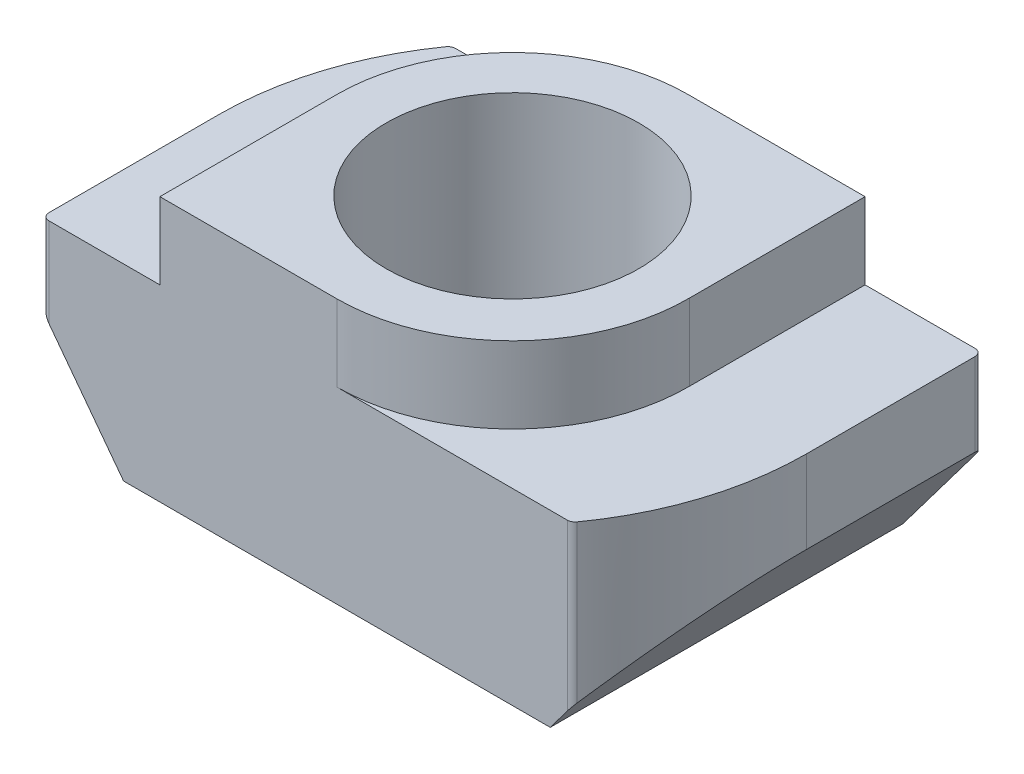
ISO-10303-21;
HEADER;
FILE_DESCRIPTION(('STEP AP214'),'2;1');
FILE_NAME('part.step','',(''),(''),'','','');
FILE_SCHEMA(('AUTOMOTIVE_DESIGN { 1 0 10303 214 1 1 1 1 }'));
ENDSEC;
DATA;
#1=APPLICATION_CONTEXT('core data for automotive mechanical design processes');
#2=APPLICATION_PROTOCOL_DEFINITION('international standard','automotive_design',2000,#1);
#3=PRODUCT_CONTEXT('',#1,'mechanical');
#4=PRODUCT('Part','Part','',(#3));
#5=PRODUCT_RELATED_PRODUCT_CATEGORY('part','',(#4));
#6=PRODUCT_DEFINITION_FORMATION('','',#4);
#7=PRODUCT_DEFINITION_CONTEXT('part definition',#1,'design');
#8=PRODUCT_DEFINITION('design','',#6,#7);
#9=PRODUCT_DEFINITION_SHAPE('','',#8);
#10=(LENGTH_UNIT() NAMED_UNIT(*) SI_UNIT(.MILLI.,.METRE.));
#11=(NAMED_UNIT(*) PLANE_ANGLE_UNIT() SI_UNIT($,.RADIAN.));
#12=(NAMED_UNIT(*) SI_UNIT($,.STERADIAN.) SOLID_ANGLE_UNIT());
#13=UNCERTAINTY_MEASURE_WITH_UNIT(LENGTH_MEASURE(1.E-05),#10,'distance_accuracy_value','');
#14=(GEOMETRIC_REPRESENTATION_CONTEXT(3) GLOBAL_UNCERTAINTY_ASSIGNED_CONTEXT((#13)) GLOBAL_UNIT_ASSIGNED_CONTEXT((#10,
#11,#12)) REPRESENTATION_CONTEXT('',''));
#15=CARTESIAN_POINT('',(0.,0.,0.));
#16=DIRECTION('',(0.,0.,1.));
#17=DIRECTION('',(1.,0.,0.));
#18=AXIS2_PLACEMENT_3D('',#15,#16,#17);
#19=CARTESIAN_POINT('',(-3.97863865589294,3.2,-2.85267364326445));
#20=DIRECTION('',(0.,-1.,0.));
#21=DIRECTION('',(0.,0.,-1.));
#22=AXIS2_PLACEMENT_3D('',#19,#20,#21);
#23=PLANE('',#22);
#24=DIRECTION('',(0.,0.,1.));
#25=VECTOR('',#24,1.);
#26=CARTESIAN_POINT('',(-3.01232635673555,3.2,3.01232635673555));
#27=LINE('',#26,#25);
#28=CARTESIAN_POINT('',(-3.01232635673555,3.2,0.));
#29=VERTEX_POINT('',#28);
#30=CARTESIAN_POINT('',(-3.01232635673555,3.2,3.01232635673555));
#31=VERTEX_POINT('',#30);
#32=EDGE_CURVE('E357',#29,#31,#27,.T.);
#33=ORIENTED_EDGE('',*,*,#32,.F.);
#34=CARTESIAN_POINT('',(-0.024551835244514,3.2,0.));
#35=DIRECTION('',(0.,1.,0.));
#36=DIRECTION('',(0.,0.,-1.));
#37=AXIS2_PLACEMENT_3D('',#34,#35,#36);
#38=CIRCLE('',#37,2.98777452149103);
#39=CARTESIAN_POINT('',(-0.0491036704889641,3.2,-2.98767364326445));
#40=VERTEX_POINT('',#39);
#41=EDGE_CURVE('E241',#40,#29,#38,.T.);
#42=ORIENTED_EDGE('',*,*,#41,.F.);
#43=DIRECTION('',(-1.,0.,0.));
#44=VECTOR('',#43,1.);
#45=CARTESIAN_POINT('',(4.85945607210742,3.2,-2.98767364326445));
#46=LINE('',#45,#44);
#47=CARTESIAN_POINT('',(-3.97863865589294,3.2,-2.98767364326445));
#48=VERTEX_POINT('',#47);
#49=EDGE_CURVE('E265',#40,#48,#46,.T.);
#50=ORIENTED_EDGE('',*,*,#49,.T.);
#51=CARTESIAN_POINT('',(-3.97863865589294,3.2,-2.85267364326445));
#52=DIRECTION('',(0.,1.,0.));
#53=DIRECTION('',(0.,0.,-1.));
#54=AXIS2_PLACEMENT_3D('',#51,#52,#53);
#55=CIRCLE('',#54,0.135);
#56=CARTESIAN_POINT('',(-4.08885480736663,3.2,-2.93063132379901));
#57=VERTEX_POINT('',#56);
#58=EDGE_CURVE('E188',#48,#57,#55,.T.);
#59=ORIENTED_EDGE('',*,*,#58,.T.);
#60=CARTESIAN_POINT('',(0.0544560721074221,3.2,0.));
#61=DIRECTION('',(0.,1.,0.));
#62=DIRECTION('',(0.,0.,-1.));
#63=AXIS2_PLACEMENT_3D('',#60,#61,#62);
#64=CIRCLE('',#63,5.075);
#65=CARTESIAN_POINT('',(-5.02054392789258,3.2,0.));
#66=VERTEX_POINT('',#65);
#67=EDGE_CURVE('E195',#57,#66,#64,.T.);
#68=ORIENTED_EDGE('',*,*,#67,.T.);
#69=DIRECTION('',(0.,0.,1.));
#70=VECTOR('',#69,1.);
#71=CARTESIAN_POINT('',(-5.02054392789258,3.2,2.89232635673555));
#72=LINE('',#71,#70);
#73=CARTESIAN_POINT('',(-5.02054392789258,3.2,2.89232635673555));
#74=VERTEX_POINT('',#73);
#75=EDGE_CURVE('E299',#66,#74,#72,.T.);
#76=ORIENTED_EDGE('',*,*,#75,.T.);
#77=CARTESIAN_POINT('',(-4.90054392789258,3.2,2.89232635673555));
#78=DIRECTION('',(0.,1.,0.));
#79=DIRECTION('',(0.,0.,-1.));
#80=AXIS2_PLACEMENT_3D('',#77,#78,#79);
#81=CIRCLE('',#80,0.12);
#82=CARTESIAN_POINT('',(-4.90054392789258,3.2,3.01232635673555));
#83=VERTEX_POINT('',#82);
#84=EDGE_CURVE('E252',#74,#83,#81,.T.);
#85=ORIENTED_EDGE('',*,*,#84,.T.);
#86=DIRECTION('',(1.,0.,0.));
#87=VECTOR('',#86,1.);
#88=CARTESIAN_POINT('',(3.92,3.2,3.01232635673555));
#89=LINE('',#88,#87);
#90=EDGE_CURVE('E242',#83,#31,#89,.T.);
#91=ORIENTED_EDGE('',*,*,#90,.T.);
#92=EDGE_LOOP('',(#33,#42,#50,#59,#68,#76,#85,#91));
#93=FACE_BOUND('',#92,.T.);
#94=ADVANCED_FACE('F43',(#93),#23,.F.);
#95=CARTESIAN_POINT('',(0.,3.2,0.0245518352445135));
#96=DIRECTION('',(0.,1.,0.));
#97=DIRECTION('',(0.,0.,1.));
#98=AXIS2_PLACEMENT_3D('',#95,#96,#97);
#99=CIRCLE('',#98,2.98777452149103);
#100=CARTESIAN_POINT('',(0.,3.2,3.01232635673555));
#101=VERTEX_POINT('',#100);
#102=CARTESIAN_POINT('',(2.98767364326445,3.2,0.));
#103=VERTEX_POINT('',#102);
#104=EDGE_CURVE('E358',#101,#103,#99,.T.);
#105=ORIENTED_EDGE('',*,*,#104,.F.);
#106=CARTESIAN_POINT('',(3.92,3.2,3.01232635673555));
#107=VERTEX_POINT('',#106);
#108=EDGE_CURVE('E247',#101,#107,#89,.T.);
#109=ORIENTED_EDGE('',*,*,#108,.T.);
#110=CARTESIAN_POINT('',(3.92,3.2,2.87732635673555));
#111=DIRECTION('',(0.,1.,0.));
#112=DIRECTION('',(0.,0.,-1.));
#113=AXIS2_PLACEMENT_3D('',#110,#111,#112);
#114=CIRCLE('',#113,0.134999999999999);
#115=CARTESIAN_POINT('',(4.02973652434524,3.2,2.9559577450269));
#116=VERTEX_POINT('',#115);
#117=EDGE_CURVE('E246',#107,#116,#114,.T.);
#118=ORIENTED_EDGE('',*,*,#117,.T.);
#119=CARTESIAN_POINT('',(-0.0955439278925783,3.2,0.));
#120=DIRECTION('',(0.,1.,0.));
#121=DIRECTION('',(0.,0.,1.));
#122=AXIS2_PLACEMENT_3D('',#119,#120,#121);
#123=CIRCLE('',#122,5.075);
#124=CARTESIAN_POINT('',(4.97945607210742,3.2,0.));
#125=VERTEX_POINT('',#124);
#126=EDGE_CURVE('E257',#116,#125,#123,.T.);
#127=ORIENTED_EDGE('',*,*,#126,.T.);
#128=DIRECTION('',(0.,0.,-1.));
#129=VECTOR('',#128,1.);
#130=CARTESIAN_POINT('',(4.97945607210742,3.2,0.));
#131=LINE('',#130,#129);
#132=CARTESIAN_POINT('',(4.97945607210742,3.2,-2.86767364326445));
#133=VERTEX_POINT('',#132);
#134=EDGE_CURVE('E260',#125,#133,#131,.T.);
#135=ORIENTED_EDGE('',*,*,#134,.T.);
#136=CARTESIAN_POINT('',(4.85945607210742,3.2,-2.86767364326445));
#137=DIRECTION('',(0.,1.,0.));
#138=DIRECTION('',(0.,0.,1.));
#139=AXIS2_PLACEMENT_3D('',#136,#137,#138);
#140=CIRCLE('',#139,0.12);
#141=CARTESIAN_POINT('',(4.85945607210742,3.2,-2.98767364326445));
#142=VERTEX_POINT('',#141);
#143=EDGE_CURVE('E263',#133,#142,#140,.T.);
#144=ORIENTED_EDGE('',*,*,#143,.T.);
#145=CARTESIAN_POINT('',(2.98767364326445,3.2,-2.98767364326445));
#146=VERTEX_POINT('',#145);
#147=EDGE_CURVE('E206',#142,#146,#46,.T.);
#148=ORIENTED_EDGE('',*,*,#147,.T.);
#149=DIRECTION('',(0.,0.,-1.));
#150=VECTOR('',#149,1.);
#151=CARTESIAN_POINT('',(2.98767364326445,3.2,0.));
#152=LINE('',#151,#150);
#153=EDGE_CURVE('E352',#103,#146,#152,.T.);
#154=ORIENTED_EDGE('',*,*,#153,.F.);
#155=EDGE_LOOP('',(#105,#109,#118,#127,#135,#144,#148,#154));
#156=FACE_BOUND('',#155,.T.);
#157=ADVANCED_FACE('F331',(#156),#23,.F.);
#158=CARTESIAN_POINT('',(-3.97863865589294,3.2,-2.85267364326445));
#159=DIRECTION('',(0.,-1.,0.));
#160=DIRECTION('',(0.,0.,-1.));
#161=AXIS2_PLACEMENT_3D('',#158,#159,#160);
#162=CYLINDRICAL_SURFACE('',#161,0.135);
#163=DIRECTION('',(0.,-1.,0.));
#164=VECTOR('',#163,1.);
#165=CARTESIAN_POINT('',(-3.97863865589294,3.2,-2.98767364326445));
#166=LINE('',#165,#164);
#167=CARTESIAN_POINT('',(-3.97863865589294,0.462659122919423,-2.98767364326445));
#168=VERTEX_POINT('',#167);
#169=EDGE_CURVE('E202',#48,#168,#166,.T.);
#170=ORIENTED_EDGE('',*,*,#169,.T.);
#171=CARTESIAN_POINT('',(-3.97863865589294,0.462659122919421,-2.85267364326445));
#172=DIRECTION('',(0.79863551004729,0.601815023152053,0.));
#173=DIRECTION('',(0.601815023152053,-0.79863551004729,0.));
#174=AXIS2_PLACEMENT_3D('',#171,#172,#173);
#175=ELLIPSE('',#174,0.224321419051533,0.135);
#176=CARTESIAN_POINT('',(-4.08885480736663,0.608920895991516,-2.93063132379901));
#177=VERTEX_POINT('',#176);
#178=EDGE_CURVE('E291',#168,#177,#175,.T.);
#179=ORIENTED_EDGE('',*,*,#178,.T.);
#180=DIRECTION('',(0.,-1.,0.));
#181=VECTOR('',#180,1.);
#182=CARTESIAN_POINT('',(-4.08885480736663,3.2,-2.93063132379901));
#183=LINE('',#182,#181);
#184=EDGE_CURVE('E237',#57,#177,#183,.T.);
#185=ORIENTED_EDGE('',*,*,#184,.F.);
#186=ORIENTED_EDGE('',*,*,#58,.F.);
#187=EDGE_LOOP('',(#170,#179,#185,#186));
#188=FACE_BOUND('',#187,.T.);
#189=ADVANCED_FACE('F45',(#188),#162,.T.);
#190=CARTESIAN_POINT('',(0.0544560721074221,3.2,0.));
#191=DIRECTION('',(0.,-1.,0.));
#192=DIRECTION('',(0.,0.,-1.));
#193=AXIS2_PLACEMENT_3D('',#190,#191,#192);
#194=CYLINDRICAL_SURFACE('',#193,5.075);
#195=ORIENTED_EDGE('',*,*,#184,.T.);
#196=CARTESIAN_POINT('',(0.0544560721074221,-4.88943835097798,0.));
#197=DIRECTION('',(0.79863551004729,0.601815023152053,0.));
#198=DIRECTION('',(0.601815023152053,-0.79863551004729,0.));
#199=AXIS2_PLACEMENT_3D('',#196,#197,#198);
#200=ELLIPSE('',#199,8.43282371619654,5.075);
#201=CARTESIAN_POINT('',(-5.02054392789258,1.84531411874553,0.));
#202=VERTEX_POINT('',#201);
#203=EDGE_CURVE('E296',#177,#202,#200,.T.);
#204=ORIENTED_EDGE('',*,*,#203,.T.);
#205=DIRECTION('',(0.,-1.,0.));
#206=VECTOR('',#205,1.);
#207=CARTESIAN_POINT('',(-5.02054392789258,3.2,0.));
#208=LINE('',#207,#206);
#209=EDGE_CURVE('E233',#66,#202,#208,.T.);
#210=ORIENTED_EDGE('',*,*,#209,.F.);
#211=ORIENTED_EDGE('',*,*,#67,.F.);
#212=EDGE_LOOP('',(#195,#204,#210,#211));
#213=FACE_BOUND('',#212,.T.);
#214=ADVANCED_FACE('F294',(#213),#194,.T.);
#215=CARTESIAN_POINT('',(-5.02054392789258,3.2,2.89232635673555));
#216=DIRECTION('',(1.,0.,0.));
#217=DIRECTION('',(0.,0.,-1.));
#218=AXIS2_PLACEMENT_3D('',#215,#216,#217);
#219=PLANE('',#218);
#220=ORIENTED_EDGE('',*,*,#209,.T.);
#221=DIRECTION('',(0.,0.,1.));
#222=VECTOR('',#221,1.);
#223=CARTESIAN_POINT('',(-5.02054392789258,1.84531411874553,-4.65));
#224=LINE('',#223,#222);
#225=CARTESIAN_POINT('',(-5.02054392789258,1.84531411874553,2.89232635673555));
#226=VERTEX_POINT('',#225);
#227=EDGE_CURVE('E497',#202,#226,#224,.T.);
#228=ORIENTED_EDGE('',*,*,#227,.T.);
#229=DIRECTION('',(0.,-1.,0.));
#230=VECTOR('',#229,1.);
#231=CARTESIAN_POINT('',(-5.02054392789258,3.2,2.89232635673555));
#232=LINE('',#231,#230);
#233=EDGE_CURVE('E229',#74,#226,#232,.T.);
#234=ORIENTED_EDGE('',*,*,#233,.F.);
#235=ORIENTED_EDGE('',*,*,#75,.F.);
#236=EDGE_LOOP('',(#220,#228,#234,#235));
#237=FACE_BOUND('',#236,.T.);
#238=ADVANCED_FACE('F501',(#237),#219,.F.);
#239=CARTESIAN_POINT('',(-4.90054392789258,3.2,2.89232635673555));
#240=DIRECTION('',(0.,-1.,0.));
#241=DIRECTION('',(0.,0.,-1.));
#242=AXIS2_PLACEMENT_3D('',#239,#240,#241);
#243=CYLINDRICAL_SURFACE('',#242,0.12);
#244=ORIENTED_EDGE('',*,*,#233,.T.);
#245=CARTESIAN_POINT('',(-4.90054392789258,1.68606874015108,2.89232635673555));
#246=DIRECTION('',(0.79863551004729,0.601815023152053,0.));
#247=DIRECTION('',(0.601815023152053,-0.79863551004729,0.));
#248=AXIS2_PLACEMENT_3D('',#245,#246,#247);
#249=ELLIPSE('',#248,0.199396816934697,0.12);
#250=CARTESIAN_POINT('',(-4.90054392789258,1.68606874015108,3.01232635673555));
#251=VERTEX_POINT('',#250);
#252=EDGE_CURVE('E395',#226,#251,#249,.T.);
#253=ORIENTED_EDGE('',*,*,#252,.T.);
#254=DIRECTION('',(0.,-1.,0.));
#255=VECTOR('',#254,1.);
#256=CARTESIAN_POINT('',(-4.90054392789258,3.2,3.01232635673555));
#257=LINE('',#256,#255);
#258=EDGE_CURVE('E225',#83,#251,#257,.T.);
#259=ORIENTED_EDGE('',*,*,#258,.F.);
#260=ORIENTED_EDGE('',*,*,#84,.F.);
#261=EDGE_LOOP('',(#244,#253,#259,#260));
#262=FACE_BOUND('',#261,.T.);
#263=ADVANCED_FACE('F444',(#262),#243,.T.);
#264=CARTESIAN_POINT('',(3.92,3.2,3.01232635673555));
#265=DIRECTION('',(0.,0.,-1.));
#266=DIRECTION('',(-1.,0.,0.));
#267=AXIS2_PLACEMENT_3D('',#264,#265,#266);
#268=PLANE('',#267);
#269=DIRECTION('',(1.,0.,0.));
#270=VECTOR('',#269,1.);
#271=CARTESIAN_POINT('',(3.92,0.,3.01232635673555));
#272=LINE('',#271,#270);
#273=CARTESIAN_POINT('',(-3.63,0.,3.01232635673555));
#274=VERTEX_POINT('',#273);
#275=CARTESIAN_POINT('',(3.63,0.,3.01232635673555));
#276=VERTEX_POINT('',#275);
#277=EDGE_CURVE('E189',#274,#276,#272,.T.);
#278=ORIENTED_EDGE('',*,*,#277,.T.);
#279=DIRECTION('',(0.601815023152053,0.79863551004729,0.));
#280=VECTOR('',#279,1.);
#281=CARTESIAN_POINT('',(5.27305129690785,2.18040271521824,3.01232635673555));
#282=LINE('',#281,#280);
#283=CARTESIAN_POINT('',(3.92,0.384842998269914,3.01232635673555));
#284=VERTEX_POINT('',#283);
#285=EDGE_CURVE('E58',#276,#284,#282,.T.);
#286=ORIENTED_EDGE('',*,*,#285,.T.);
#287=DIRECTION('',(0.,-1.,0.));
#288=VECTOR('',#287,1.);
#289=CARTESIAN_POINT('',(3.92,3.2,3.01232635673555));
#290=LINE('',#289,#288);
#291=EDGE_CURVE('E221',#107,#284,#290,.T.);
#292=ORIENTED_EDGE('',*,*,#291,.F.);
#293=ORIENTED_EDGE('',*,*,#108,.F.);
#294=DIRECTION('',(0.,-1.,0.));
#295=VECTOR('',#294,1.);
#296=CARTESIAN_POINT('',(0.,4.5,3.01232635673555));
#297=LINE('',#296,#295);
#298=CARTESIAN_POINT('',(0.,4.5,3.01232635673555));
#299=VERTEX_POINT('',#298);
#300=EDGE_CURVE('E382',#299,#101,#297,.T.);
#301=ORIENTED_EDGE('',*,*,#300,.F.);
#302=DIRECTION('',(1.,0.,0.));
#303=VECTOR('',#302,1.);
#304=CARTESIAN_POINT('',(0.,4.5,3.01232635673555));
#305=LINE('',#304,#303);
#306=CARTESIAN_POINT('',(-3.01232635673555,4.5,3.01232635673555));
#307=VERTEX_POINT('',#306);
#308=EDGE_CURVE('E364',#307,#299,#305,.T.);
#309=ORIENTED_EDGE('',*,*,#308,.F.);
#310=DIRECTION('',(0.,-1.,0.));
#311=VECTOR('',#310,1.);
#312=CARTESIAN_POINT('',(-3.01232635673555,4.5,3.01232635673555));
#313=LINE('',#312,#311);
#314=EDGE_CURVE('E378',#307,#31,#313,.T.);
#315=ORIENTED_EDGE('',*,*,#314,.T.);
#316=ORIENTED_EDGE('',*,*,#90,.F.);
#317=ORIENTED_EDGE('',*,*,#258,.T.);
#318=DIRECTION('',(0.601815023152053,-0.79863551004729,0.));
#319=VECTOR('',#318,1.);
#320=CARTESIAN_POINT('',(-2.43354973171045,-1.58774313285998,3.01232635673555));
#321=LINE('',#320,#319);
#322=EDGE_CURVE('E388',#251,#274,#321,.T.);
#323=ORIENTED_EDGE('',*,*,#322,.T.);
#324=EDGE_LOOP('',(#278,#286,#292,#293,#301,#309,#315,#316,#317,#323));
#325=FACE_BOUND('',#324,.T.);
#326=ADVANCED_FACE('F391',(#325),#268,.F.);
#327=CARTESIAN_POINT('',(3.92,3.2,2.87732635673555));
#328=DIRECTION('',(0.,-1.,0.));
#329=DIRECTION('',(0.,0.,-1.));
#330=AXIS2_PLACEMENT_3D('',#327,#328,#329);
#331=CYLINDRICAL_SURFACE('',#330,0.134999999999999);
#332=ORIENTED_EDGE('',*,*,#291,.T.);
#333=CARTESIAN_POINT('',(3.92,0.384842998269914,2.87732635673555));
#334=DIRECTION('',(-0.79863551004729,0.601815023152053,0.));
#335=DIRECTION('',(-0.601815023152053,-0.79863551004729,0.));
#336=AXIS2_PLACEMENT_3D('',#333,#334,#335);
#337=ELLIPSE('',#336,0.224321419051532,0.134999999999999);
#338=CARTESIAN_POINT('',(4.02973652434524,0.530468284644888,2.9559577450269));
#339=VERTEX_POINT('',#338);
#340=EDGE_CURVE('E493',#284,#339,#337,.T.);
#341=ORIENTED_EDGE('',*,*,#340,.T.);
#342=DIRECTION('',(0.,-1.,0.));
#343=VECTOR('',#342,1.);
#344=CARTESIAN_POINT('',(4.02973652434524,3.2,2.9559577450269));
#345=LINE('',#344,#343);
#346=EDGE_CURVE('E217',#116,#339,#345,.T.);
#347=ORIENTED_EDGE('',*,*,#346,.F.);
#348=ORIENTED_EDGE('',*,*,#117,.F.);
#349=EDGE_LOOP('',(#332,#341,#347,#348));
#350=FACE_BOUND('',#349,.T.);
#351=ADVANCED_FACE('F512',(#350),#331,.T.);
#352=CARTESIAN_POINT('',(-0.0955439278925783,3.2,0.));
#353=DIRECTION('',(0.,-1.,0.));
#354=DIRECTION('',(0.,0.,-1.));
#355=AXIS2_PLACEMENT_3D('',#352,#353,#354);
#356=CYLINDRICAL_SURFACE('',#355,5.075);
#357=ORIENTED_EDGE('',*,*,#346,.T.);
#358=CARTESIAN_POINT('',(-0.0955439278925783,-4.94396377722915,0.));
#359=DIRECTION('',(-0.79863551004729,0.601815023152053,0.));
#360=DIRECTION('',(-0.601815023152053,-0.79863551004729,0.));
#361=AXIS2_PLACEMENT_3D('',#358,#359,#360);
#362=ELLIPSE('',#361,8.43282371619654,5.075);
#363=CARTESIAN_POINT('',(4.97945607210742,1.79078869249435,0.));
#364=VERTEX_POINT('',#363);
#365=EDGE_CURVE('E489',#339,#364,#362,.T.);
#366=ORIENTED_EDGE('',*,*,#365,.T.);
#367=DIRECTION('',(0.,-1.,0.));
#368=VECTOR('',#367,1.);
#369=CARTESIAN_POINT('',(4.97945607210742,3.2,0.));
#370=LINE('',#369,#368);
#371=EDGE_CURVE('E213',#125,#364,#370,.T.);
#372=ORIENTED_EDGE('',*,*,#371,.F.);
#373=ORIENTED_EDGE('',*,*,#126,.F.);
#374=EDGE_LOOP('',(#357,#366,#372,#373));
#375=FACE_BOUND('',#374,.T.);
#376=ADVANCED_FACE('F515',(#375),#356,.T.);
#377=CARTESIAN_POINT('',(4.97945607210742,3.2,0.));
#378=DIRECTION('',(-1.,0.,0.));
#379=DIRECTION('',(0.,0.,1.));
#380=AXIS2_PLACEMENT_3D('',#377,#378,#379);
#381=PLANE('',#380);
#382=ORIENTED_EDGE('',*,*,#371,.T.);
#383=DIRECTION('',(0.,0.,-1.));
#384=VECTOR('',#383,1.);
#385=CARTESIAN_POINT('',(4.97945607210742,1.79078869249435,0.));
#386=LINE('',#385,#384);
#387=CARTESIAN_POINT('',(4.97945607210742,1.79078869249435,-2.86767364326445));
#388=VERTEX_POINT('',#387);
#389=EDGE_CURVE('E485',#364,#388,#386,.T.);
#390=ORIENTED_EDGE('',*,*,#389,.T.);
#391=DIRECTION('',(0.,-1.,0.));
#392=VECTOR('',#391,1.);
#393=CARTESIAN_POINT('',(4.97945607210742,3.2,-2.86767364326445));
#394=LINE('',#393,#392);
#395=EDGE_CURVE('E209',#133,#388,#394,.T.);
#396=ORIENTED_EDGE('',*,*,#395,.F.);
#397=ORIENTED_EDGE('',*,*,#134,.F.);
#398=EDGE_LOOP('',(#382,#390,#396,#397));
#399=FACE_BOUND('',#398,.T.);
#400=ADVANCED_FACE('F518',(#399),#381,.F.);
#401=CARTESIAN_POINT('',(4.85945607210742,3.2,-2.86767364326445));
#402=DIRECTION('',(0.,-1.,0.));
#403=DIRECTION('',(0.,0.,-1.));
#404=AXIS2_PLACEMENT_3D('',#401,#402,#403);
#405=CYLINDRICAL_SURFACE('',#404,0.12);
#406=ORIENTED_EDGE('',*,*,#395,.T.);
#407=CARTESIAN_POINT('',(4.85945607210742,1.6315433138999,-2.86767364326445));
#408=DIRECTION('',(-0.79863551004729,0.601815023152053,0.));
#409=DIRECTION('',(-0.601815023152053,-0.79863551004729,0.));
#410=AXIS2_PLACEMENT_3D('',#407,#408,#409);
#411=ELLIPSE('',#410,0.199396816934697,0.12);
#412=CARTESIAN_POINT('',(4.85945607210742,1.6315433138999,-2.98767364326445));
#413=VERTEX_POINT('',#412);
#414=EDGE_CURVE('E182',#388,#413,#411,.T.);
#415=ORIENTED_EDGE('',*,*,#414,.T.);
#416=DIRECTION('',(0.,-1.,0.));
#417=VECTOR('',#416,1.);
#418=CARTESIAN_POINT('',(4.85945607210742,3.2,-2.98767364326445));
#419=LINE('',#418,#417);
#420=EDGE_CURVE('E180',#142,#413,#419,.T.);
#421=ORIENTED_EDGE('',*,*,#420,.F.);
#422=ORIENTED_EDGE('',*,*,#143,.F.);
#423=EDGE_LOOP('',(#406,#415,#421,#422));
#424=FACE_BOUND('',#423,.T.);
#425=ADVANCED_FACE('F338',(#424),#405,.T.);
#426=CARTESIAN_POINT('',(4.85945607210742,3.2,-2.98767364326445));
#427=DIRECTION('',(0.,0.,1.));
#428=DIRECTION('',(1.,0.,0.));
#429=AXIS2_PLACEMENT_3D('',#426,#427,#428);
#430=PLANE('',#429);
#431=ORIENTED_EDGE('',*,*,#420,.T.);
#432=DIRECTION('',(-0.601815023152053,-0.79863551004729,0.));
#433=VECTOR('',#432,1.);
#434=CARTESIAN_POINT('',(5.61330473915061,2.63193428378501,-2.98767364326445));
#435=LINE('',#434,#433);
#436=CARTESIAN_POINT('',(3.63,0.,-2.98767364326445));
#437=VERTEX_POINT('',#436);
#438=EDGE_CURVE('E171',#413,#437,#435,.T.);
#439=ORIENTED_EDGE('',*,*,#438,.T.);
#440=DIRECTION('',(-1.,0.,0.));
#441=VECTOR('',#440,1.);
#442=CARTESIAN_POINT('',(4.85945607210742,0.,-2.98767364326445));
#443=LINE('',#442,#441);
#444=CARTESIAN_POINT('',(-3.63,0.,-2.98767364326445));
#445=VERTEX_POINT('',#444);
#446=EDGE_CURVE('E66',#437,#445,#443,.T.);
#447=ORIENTED_EDGE('',*,*,#446,.T.);
#448=DIRECTION('',(-0.601815023152053,0.79863551004729,0.));
#449=VECTOR('',#448,1.);
#450=CARTESIAN_POINT('',(-2.09329628946769,-2.03927470142675,-2.98767364326445));
#451=LINE('',#450,#449);
#452=EDGE_CURVE('E288',#445,#168,#451,.T.);
#453=ORIENTED_EDGE('',*,*,#452,.T.);
#454=ORIENTED_EDGE('',*,*,#169,.F.);
#455=ORIENTED_EDGE('',*,*,#49,.F.);
#456=CARTESIAN_POINT('',(-0.024551835244514,3.2,0.));
#457=DIRECTION('',(0.,1.,0.));
#458=DIRECTION('',(0.0082174324293593,0.,-0.999966236332142));
#459=AXIS2_PLACEMENT_3D('',#456,#457,#458);
#460=CIRCLE('',#459,2.98777452149103);
#461=CARTESIAN_POINT('',(0.,3.2,-2.98767364326445));
#462=VERTEX_POINT('',#461);
#463=EDGE_CURVE('E271',#462,#40,#460,.T.);
#464=ORIENTED_EDGE('',*,*,#463,.F.);
#465=DIRECTION('',(0.,-1.,0.));
#466=VECTOR('',#465,1.);
#467=CARTESIAN_POINT('',(0.,4.5,-2.98767364326445));
#468=LINE('',#467,#466);
#469=CARTESIAN_POINT('',(0.,4.5,-2.98767364326445));
#470=VERTEX_POINT('',#469);
#471=EDGE_CURVE('E450',#470,#462,#468,.T.);
#472=ORIENTED_EDGE('',*,*,#471,.F.);
#473=DIRECTION('',(-1.,0.,0.));
#474=VECTOR('',#473,1.);
#475=CARTESIAN_POINT('',(2.98767364326445,4.5,-2.98767364326445));
#476=LINE('',#475,#474);
#477=CARTESIAN_POINT('',(2.98767364326445,4.5,-2.98767364326445));
#478=VERTEX_POINT('',#477);
#479=EDGE_CURVE('E410',#478,#470,#476,.T.);
#480=ORIENTED_EDGE('',*,*,#479,.F.);
#481=DIRECTION('',(0.,-1.,0.));
#482=VECTOR('',#481,1.);
#483=CARTESIAN_POINT('',(2.98767364326445,4.5,-2.98767364326445));
#484=LINE('',#483,#482);
#485=EDGE_CURVE('E359',#478,#146,#484,.T.);
#486=ORIENTED_EDGE('',*,*,#485,.T.);
#487=ORIENTED_EDGE('',*,*,#147,.F.);
#488=EDGE_LOOP('',(#431,#439,#447,#453,#454,#455,#464,#472,#480,#486,#487));
#489=FACE_BOUND('',#488,.T.);
#490=ADVANCED_FACE('F177',(#489),#430,.F.);
#491=CARTESIAN_POINT('',(-3.97863865589294,0.,-2.85267364326445));
#492=DIRECTION('',(0.,-1.,0.));
#493=DIRECTION('',(0.,0.,-1.));
#494=AXIS2_PLACEMENT_3D('',#491,#492,#493);
#495=PLANE('',#494);
#496=CARTESIAN_POINT('',(-0.024551835244514,0.,0.));
#497=DIRECTION('',(0.,-1.,0.));
#498=DIRECTION('',(0.,0.,-1.));
#499=AXIS2_PLACEMENT_3D('',#496,#497,#498);
#500=CIRCLE('',#499,2.15);
#501=CARTESIAN_POINT('',(-0.024551835244514,0.,-2.15));
#502=VERTEX_POINT('',#501);
#503=EDGE_CURVE('E479',#502,#502,#500,.F.);
#504=ORIENTED_EDGE('',*,*,#503,.T.);
#505=EDGE_LOOP('',(#504));
#506=FACE_BOUND('',#505,.T.);
#507=DIRECTION('',(0.,0.,-1.));
#508=VECTOR('',#507,1.);
#509=CARTESIAN_POINT('',(3.63,0.,-2.85267364326445));
#510=LINE('',#509,#508);
#511=EDGE_CURVE('E11',#276,#437,#510,.T.);
#512=ORIENTED_EDGE('',*,*,#511,.F.);
#513=ORIENTED_EDGE('',*,*,#277,.F.);
#514=DIRECTION('',(0.,0.,1.));
#515=VECTOR('',#514,1.);
#516=CARTESIAN_POINT('',(-3.63,0.,-2.85267364326445));
#517=LINE('',#516,#515);
#518=EDGE_CURVE('E52',#445,#274,#517,.T.);
#519=ORIENTED_EDGE('',*,*,#518,.F.);
#520=ORIENTED_EDGE('',*,*,#446,.F.);
#521=EDGE_LOOP('',(#512,#513,#519,#520));
#522=FACE_BOUND('',#521,.T.);
#523=ADVANCED_FACE('F186',(#506,#522),#495,.T.);
#524=CARTESIAN_POINT('',(0.,4.5,0.0245518352445135));
#525=DIRECTION('',(0.,-1.,0.));
#526=DIRECTION('',(0.,0.,-1.));
#527=AXIS2_PLACEMENT_3D('',#524,#525,#526);
#528=CYLINDRICAL_SURFACE('',#527,2.98777452149103);
#529=ORIENTED_EDGE('',*,*,#104,.T.);
#530=DIRECTION('',(0.,-1.,0.));
#531=VECTOR('',#530,1.);
#532=CARTESIAN_POINT('',(2.98767364326445,4.5,0.));
#533=LINE('',#532,#531);
#534=CARTESIAN_POINT('',(2.98767364326445,4.5,0.));
#535=VERTEX_POINT('',#534);
#536=EDGE_CURVE('E198',#535,#103,#533,.T.);
#537=ORIENTED_EDGE('',*,*,#536,.F.);
#538=CARTESIAN_POINT('',(0.,4.5,0.0245518352445135));
#539=DIRECTION('',(0.,1.,0.));
#540=DIRECTION('',(0.,0.,1.));
#541=AXIS2_PLACEMENT_3D('',#538,#539,#540);
#542=CIRCLE('',#541,2.98777452149103);
#543=EDGE_CURVE('E375',#299,#535,#542,.T.);
#544=ORIENTED_EDGE('',*,*,#543,.F.);
#545=ORIENTED_EDGE('',*,*,#300,.T.);
#546=EDGE_LOOP('',(#529,#537,#544,#545));
#547=FACE_BOUND('',#546,.T.);
#548=ADVANCED_FACE('F324',(#547),#528,.T.);
#549=CARTESIAN_POINT('',(2.98767364326445,4.5,0.));
#550=DIRECTION('',(-1.,0.,0.));
#551=DIRECTION('',(0.,0.,1.));
#552=AXIS2_PLACEMENT_3D('',#549,#550,#551);
#553=PLANE('',#552);
#554=ORIENTED_EDGE('',*,*,#153,.T.);
#555=ORIENTED_EDGE('',*,*,#485,.F.);
#556=DIRECTION('',(0.,0.,-1.));
#557=VECTOR('',#556,1.);
#558=CARTESIAN_POINT('',(2.98767364326445,4.5,0.));
#559=LINE('',#558,#557);
#560=EDGE_CURVE('E408',#535,#478,#559,.T.);
#561=ORIENTED_EDGE('',*,*,#560,.F.);
#562=ORIENTED_EDGE('',*,*,#536,.T.);
#563=EDGE_LOOP('',(#554,#555,#561,#562));
#564=FACE_BOUND('',#563,.T.);
#565=ADVANCED_FACE('F320',(#564),#553,.F.);
#566=CARTESIAN_POINT('',(-0.024551835244514,4.5,0.));
#567=DIRECTION('',(0.,-1.,0.));
#568=DIRECTION('',(0.,0.,-1.));
#569=AXIS2_PLACEMENT_3D('',#566,#567,#568);
#570=CYLINDRICAL_SURFACE('',#569,2.98777452149103);
#571=ORIENTED_EDGE('',*,*,#463,.T.);
#572=ORIENTED_EDGE('',*,*,#41,.T.);
#573=DIRECTION('',(0.,-1.,0.));
#574=VECTOR('',#573,1.);
#575=CARTESIAN_POINT('',(-3.01232635673555,4.5,0.));
#576=LINE('',#575,#574);
#577=CARTESIAN_POINT('',(-3.01232635673555,4.5,0.));
#578=VERTEX_POINT('',#577);
#579=EDGE_CURVE('E368',#578,#29,#576,.T.);
#580=ORIENTED_EDGE('',*,*,#579,.F.);
#581=CARTESIAN_POINT('',(-0.024551835244514,4.5,0.));
#582=DIRECTION('',(0.,1.,0.));
#583=DIRECTION('',(0.,0.,-1.));
#584=AXIS2_PLACEMENT_3D('',#581,#582,#583);
#585=CIRCLE('',#584,2.98777452149103);
#586=EDGE_CURVE('E413',#470,#578,#585,.T.);
#587=ORIENTED_EDGE('',*,*,#586,.F.);
#588=ORIENTED_EDGE('',*,*,#471,.T.);
#589=EDGE_LOOP('',(#571,#572,#580,#587,#588));
#590=FACE_BOUND('',#589,.T.);
#591=ADVANCED_FACE('F309',(#590),#570,.T.);
#592=CARTESIAN_POINT('',(-3.01232635673555,4.5,3.01232635673555));
#593=DIRECTION('',(1.,0.,0.));
#594=DIRECTION('',(0.,0.,-1.));
#595=AXIS2_PLACEMENT_3D('',#592,#593,#594);
#596=PLANE('',#595);
#597=ORIENTED_EDGE('',*,*,#32,.T.);
#598=ORIENTED_EDGE('',*,*,#314,.F.);
#599=DIRECTION('',(0.,0.,1.));
#600=VECTOR('',#599,1.);
#601=CARTESIAN_POINT('',(-3.01232635673555,4.5,3.01232635673555));
#602=LINE('',#601,#600);
#603=EDGE_CURVE('E415',#578,#307,#602,.T.);
#604=ORIENTED_EDGE('',*,*,#603,.F.);
#605=ORIENTED_EDGE('',*,*,#579,.T.);
#606=EDGE_LOOP('',(#597,#598,#604,#605));
#607=FACE_BOUND('',#606,.T.);
#608=ADVANCED_FACE('F319',(#607),#596,.F.);
#609=CARTESIAN_POINT('',(0.,4.5,0.0245518352445135));
#610=DIRECTION('',(0.,1.,0.));
#611=DIRECTION('',(0.,0.,1.));
#612=AXIS2_PLACEMENT_3D('',#609,#610,#611);
#613=PLANE('',#612);
#614=CARTESIAN_POINT('',(-0.024551835244514,4.5,0.));
#615=DIRECTION('',(0.,1.,0.));
#616=DIRECTION('',(0.,0.,1.));
#617=AXIS2_PLACEMENT_3D('',#614,#615,#616);
#618=CIRCLE('',#617,2.15);
#619=CARTESIAN_POINT('',(-0.024551835244514,4.5,2.15));
#620=VERTEX_POINT('',#619);
#621=EDGE_CURVE('E183',#620,#620,#618,.T.);
#622=ORIENTED_EDGE('',*,*,#621,.F.);
#623=EDGE_LOOP('',(#622));
#624=FACE_BOUND('',#623,.T.);
#625=ORIENTED_EDGE('',*,*,#543,.T.);
#626=ORIENTED_EDGE('',*,*,#560,.T.);
#627=ORIENTED_EDGE('',*,*,#479,.T.);
#628=ORIENTED_EDGE('',*,*,#586,.T.);
#629=ORIENTED_EDGE('',*,*,#603,.T.);
#630=ORIENTED_EDGE('',*,*,#308,.T.);
#631=EDGE_LOOP('',(#625,#626,#627,#628,#629,#630));
#632=FACE_BOUND('',#631,.T.);
#633=ADVANCED_FACE('F459',(#624,#632),#613,.T.);
#634=CARTESIAN_POINT('',(-3.63,0.,-4.65));
#635=DIRECTION('',(0.79863551004729,0.601815023152053,0.));
#636=DIRECTION('',(-0.601815023152053,0.79863551004729,0.));
#637=AXIS2_PLACEMENT_3D('',#634,#635,#636);
#638=PLANE('',#637);
#639=ORIENTED_EDGE('',*,*,#227,.F.);
#640=ORIENTED_EDGE('',*,*,#203,.F.);
#641=ORIENTED_EDGE('',*,*,#178,.F.);
#642=ORIENTED_EDGE('',*,*,#452,.F.);
#643=ORIENTED_EDGE('',*,*,#518,.T.);
#644=ORIENTED_EDGE('',*,*,#322,.F.);
#645=ORIENTED_EDGE('',*,*,#252,.F.);
#646=EDGE_LOOP('',(#639,#640,#641,#642,#643,#644,#645));
#647=FACE_BOUND('',#646,.T.);
#648=ADVANCED_FACE('F387',(#647),#638,.F.);
#649=CARTESIAN_POINT('',(3.63,0.,-4.65));
#650=DIRECTION('',(-0.79863551004729,0.601815023152053,0.));
#651=DIRECTION('',(-0.601815023152053,-0.79863551004729,0.));
#652=AXIS2_PLACEMENT_3D('',#649,#650,#651);
#653=PLANE('',#652);
#654=ORIENTED_EDGE('',*,*,#511,.T.);
#655=ORIENTED_EDGE('',*,*,#438,.F.);
#656=ORIENTED_EDGE('',*,*,#414,.F.);
#657=ORIENTED_EDGE('',*,*,#389,.F.);
#658=ORIENTED_EDGE('',*,*,#365,.F.);
#659=ORIENTED_EDGE('',*,*,#340,.F.);
#660=ORIENTED_EDGE('',*,*,#285,.F.);
#661=EDGE_LOOP('',(#654,#655,#656,#657,#658,#659,#660));
#662=FACE_BOUND('',#661,.T.);
#663=ADVANCED_FACE('F170',(#662),#653,.F.);
#664=CARTESIAN_POINT('',(-0.024551835244514,-0.00100000000000013,0.));
#665=DIRECTION('',(0.,1.,0.));
#666=DIRECTION('',(0.,0.,1.));
#667=AXIS2_PLACEMENT_3D('',#664,#665,#666);
#668=CYLINDRICAL_SURFACE('',#667,2.15);
#669=ORIENTED_EDGE('',*,*,#503,.F.);
#670=EDGE_LOOP('',(#669));
#671=FACE_BOUND('',#670,.T.);
#672=ORIENTED_EDGE('',*,*,#621,.T.);
#673=EDGE_LOOP('',(#672));
#674=FACE_BOUND('',#673,.T.);
#675=ADVANCED_FACE('F471',(#671,#674),#668,.F.);
#676=CLOSED_SHELL('',(#94,#157,#189,#214,#238,#263,#326,#351,#376,#400,#425,#490,#523,#548,#565,
#591,#608,#633,#648,#663,#675));
#677=MANIFOLD_SOLID_BREP('B2',#676);
#678=ADVANCED_BREP_SHAPE_REPRESENTATION('',(#18,#677),#14);
#679=SHAPE_DEFINITION_REPRESENTATION(#9,#678);
ENDSEC;
END-ISO-10303-21;
